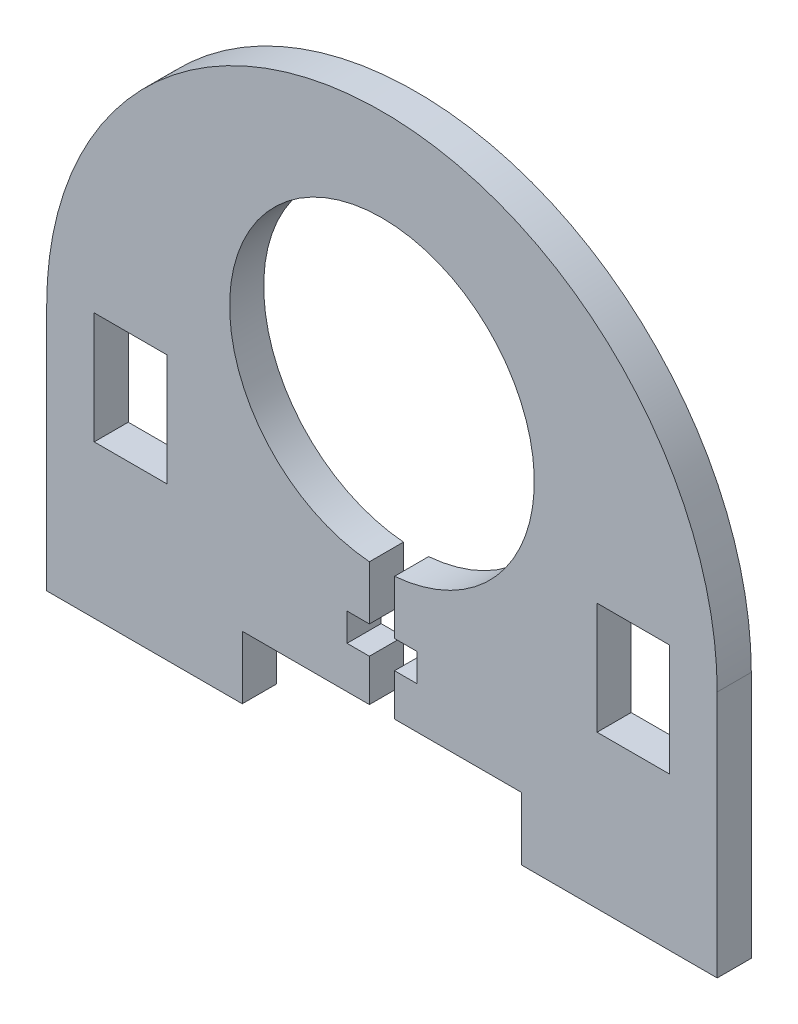
ISO-10303-21;
HEADER;
FILE_DESCRIPTION(('STEP AP214'),'2;1');
FILE_NAME('part.step','',(''),(''),'','','');
FILE_SCHEMA(('AUTOMOTIVE_DESIGN { 1 0 10303 214 1 1 1 1 }'));
ENDSEC;
DATA;
#1=APPLICATION_CONTEXT('core data for automotive mechanical design processes');
#2=APPLICATION_PROTOCOL_DEFINITION('international standard','automotive_design',2000,#1);
#3=PRODUCT_CONTEXT('',#1,'mechanical');
#4=PRODUCT('Part','Part','',(#3));
#5=PRODUCT_RELATED_PRODUCT_CATEGORY('part','',(#4));
#6=PRODUCT_DEFINITION_FORMATION('','',#4);
#7=PRODUCT_DEFINITION_CONTEXT('part definition',#1,'design');
#8=PRODUCT_DEFINITION('design','',#6,#7);
#9=PRODUCT_DEFINITION_SHAPE('','',#8);
#10=(LENGTH_UNIT() NAMED_UNIT(*) SI_UNIT(.MILLI.,.METRE.));
#11=(NAMED_UNIT(*) PLANE_ANGLE_UNIT() SI_UNIT($,.RADIAN.));
#12=(NAMED_UNIT(*) SI_UNIT($,.STERADIAN.) SOLID_ANGLE_UNIT());
#13=UNCERTAINTY_MEASURE_WITH_UNIT(LENGTH_MEASURE(1.E-05),#10,'distance_accuracy_value','');
#14=(GEOMETRIC_REPRESENTATION_CONTEXT(3) GLOBAL_UNCERTAINTY_ASSIGNED_CONTEXT((#13)) GLOBAL_UNIT_ASSIGNED_CONTEXT((#10,
#11,#12)) REPRESENTATION_CONTEXT('',''));
#15=CARTESIAN_POINT('',(0.,0.,0.));
#16=DIRECTION('',(0.,0.,1.));
#17=DIRECTION('',(1.,0.,0.));
#18=AXIS2_PLACEMENT_3D('',#15,#16,#17);
#19=CARTESIAN_POINT('',(-12.7,-5.54507996900001,-0.00100000000000013));
#20=DIRECTION('',(0.,1.,0.));
#21=DIRECTION('',(0.,0.,1.));
#22=AXIS2_PLACEMENT_3D('',#19,#20,#21);
#23=PLANE('',#22);
#24=DIRECTION('',(-1.,0.,0.));
#25=VECTOR('',#24,1.);
#26=CARTESIAN_POINT('',(-12.7,-5.54507996900001,3.0988));
#27=LINE('',#26,#25);
#28=CARTESIAN_POINT('',(12.7,-5.54507996900001,3.0988));
#29=VERTEX_POINT('',#28);
#30=CARTESIAN_POINT('',(1.143,-5.54507996900001,3.0988));
#31=VERTEX_POINT('',#30);
#32=EDGE_CURVE('E452',#29,#31,#27,.T.);
#33=ORIENTED_EDGE('',*,*,#32,.T.);
#34=DIRECTION('',(0.,0.,1.));
#35=VECTOR('',#34,1.);
#36=CARTESIAN_POINT('',(1.143,-5.54507996900001,-0.00100000000000013));
#37=LINE('',#36,#35);
#38=CARTESIAN_POINT('',(1.143,-5.54507996900001,0.));
#39=VERTEX_POINT('',#38);
#40=EDGE_CURVE('E413',#39,#31,#37,.T.);
#41=ORIENTED_EDGE('',*,*,#40,.F.);
#42=DIRECTION('',(-1.,0.,0.));
#43=VECTOR('',#42,1.);
#44=CARTESIAN_POINT('',(-12.7,-5.54507996900001,0.));
#45=LINE('',#44,#43);
#46=CARTESIAN_POINT('',(12.7,-5.54507996900001,0.));
#47=VERTEX_POINT('',#46);
#48=EDGE_CURVE('E436',#47,#39,#45,.T.);
#49=ORIENTED_EDGE('',*,*,#48,.F.);
#50=DIRECTION('',(0.,0.,1.));
#51=VECTOR('',#50,1.);
#52=CARTESIAN_POINT('',(12.7,-5.54507996900001,-0.00100000000000013));
#53=LINE('',#52,#51);
#54=EDGE_CURVE('E462',#47,#29,#53,.T.);
#55=ORIENTED_EDGE('',*,*,#54,.T.);
#56=EDGE_LOOP('',(#33,#41,#49,#55));
#57=FACE_BOUND('',#56,.T.);
#58=ADVANCED_FACE('F38',(#57),#23,.F.);
#59=CARTESIAN_POINT('',(30.48,-11.260079969,3.0988));
#60=DIRECTION('',(0.,1.,0.));
#61=DIRECTION('',(-1.,0.,0.));
#62=AXIS2_PLACEMENT_3D('',#59,#60,#61);
#63=PLANE('',#62);
#64=DIRECTION('',(1.,0.,0.));
#65=VECTOR('',#64,1.);
#66=CARTESIAN_POINT('',(30.48,-11.260079969,0.));
#67=LINE('',#66,#65);
#68=CARTESIAN_POINT('',(-30.48,-11.260079969,0.));
#69=VERTEX_POINT('',#68);
#70=CARTESIAN_POINT('',(-12.7,-11.260079969,0.));
#71=VERTEX_POINT('',#70);
#72=EDGE_CURVE('E503',#69,#71,#67,.T.);
#73=ORIENTED_EDGE('',*,*,#72,.T.);
#74=DIRECTION('',(0.,0.,1.));
#75=VECTOR('',#74,1.);
#76=CARTESIAN_POINT('',(-12.7,-11.260079969,-0.00100000000000013));
#77=LINE('',#76,#75);
#78=CARTESIAN_POINT('',(-12.7,-11.260079969,3.0988));
#79=VERTEX_POINT('',#78);
#80=EDGE_CURVE('E456',#71,#79,#77,.T.);
#81=ORIENTED_EDGE('',*,*,#80,.T.);
#82=DIRECTION('',(1.,0.,0.));
#83=VECTOR('',#82,1.);
#84=CARTESIAN_POINT('',(30.48,-11.260079969,3.0988));
#85=LINE('',#84,#83);
#86=CARTESIAN_POINT('',(-30.48,-11.260079969,3.0988));
#87=VERTEX_POINT('',#86);
#88=EDGE_CURVE('E488',#87,#79,#85,.T.);
#89=ORIENTED_EDGE('',*,*,#88,.F.);
#90=DIRECTION('',(0.,0.,-1.));
#91=VECTOR('',#90,1.);
#92=CARTESIAN_POINT('',(-30.48,-11.260079969,3.0988));
#93=LINE('',#92,#91);
#94=EDGE_CURVE('E47',#87,#69,#93,.T.);
#95=ORIENTED_EDGE('',*,*,#94,.T.);
#96=EDGE_LOOP('',(#73,#81,#89,#95));
#97=FACE_BOUND('',#96,.T.);
#98=ADVANCED_FACE('F521',(#97),#63,.F.);
#99=CARTESIAN_POINT('',(0.,11.260079969,3.0988));
#100=DIRECTION('',(0.,0.,-1.));
#101=DIRECTION('',(-1.,0.,0.));
#102=AXIS2_PLACEMENT_3D('',#99,#100,#101);
#103=CYLINDRICAL_SURFACE('',#102,30.48);
#104=CARTESIAN_POINT('',(0.,11.260079969,0.));
#105=DIRECTION('',(0.,0.,1.));
#106=DIRECTION('',(-1.,0.,0.));
#107=AXIS2_PLACEMENT_3D('',#104,#105,#106);
#108=CIRCLE('',#107,30.48);
#109=CARTESIAN_POINT('',(30.48,11.260079969,0.));
#110=VERTEX_POINT('',#109);
#111=CARTESIAN_POINT('',(-30.48,11.260079969,0.));
#112=VERTEX_POINT('',#111);
#113=EDGE_CURVE('E475',#110,#112,#108,.T.);
#114=ORIENTED_EDGE('',*,*,#113,.T.);
#115=DIRECTION('',(0.,0.,-1.));
#116=VECTOR('',#115,1.);
#117=CARTESIAN_POINT('',(-30.48,11.260079969,3.0988));
#118=LINE('',#117,#116);
#119=CARTESIAN_POINT('',(-30.48,11.260079969,3.0988));
#120=VERTEX_POINT('',#119);
#121=EDGE_CURVE('E11',#120,#112,#118,.T.);
#122=ORIENTED_EDGE('',*,*,#121,.F.);
#123=CARTESIAN_POINT('',(0.,11.260079969,3.0988));
#124=DIRECTION('',(0.,0.,1.));
#125=DIRECTION('',(-1.,0.,0.));
#126=AXIS2_PLACEMENT_3D('',#123,#124,#125);
#127=CIRCLE('',#126,30.48);
#128=CARTESIAN_POINT('',(30.48,11.260079969,3.0988));
#129=VERTEX_POINT('',#128);
#130=EDGE_CURVE('E479',#129,#120,#127,.T.);
#131=ORIENTED_EDGE('',*,*,#130,.F.);
#132=DIRECTION('',(0.,0.,-1.));
#133=VECTOR('',#132,1.);
#134=CARTESIAN_POINT('',(30.48,11.260079969,3.0988));
#135=LINE('',#134,#133);
#136=EDGE_CURVE('E495',#129,#110,#135,.T.);
#137=ORIENTED_EDGE('',*,*,#136,.T.);
#138=EDGE_LOOP('',(#114,#122,#131,#137));
#139=FACE_BOUND('',#138,.T.);
#140=ADVANCED_FACE('F40',(#139),#103,.T.);
#141=CARTESIAN_POINT('',(-30.48,-11.260079969,3.0988));
#142=DIRECTION('',(1.,0.,0.));
#143=DIRECTION('',(0.,1.,0.));
#144=AXIS2_PLACEMENT_3D('',#141,#142,#143);
#145=PLANE('',#144);
#146=DIRECTION('',(0.,-1.,0.));
#147=VECTOR('',#146,1.);
#148=CARTESIAN_POINT('',(-30.48,-11.260079969,0.));
#149=LINE('',#148,#147);
#150=EDGE_CURVE('E499',#112,#69,#149,.T.);
#151=ORIENTED_EDGE('',*,*,#150,.T.);
#152=ORIENTED_EDGE('',*,*,#94,.F.);
#153=DIRECTION('',(0.,-1.,0.));
#154=VECTOR('',#153,1.);
#155=CARTESIAN_POINT('',(-30.48,-11.260079969,3.0988));
#156=LINE('',#155,#154);
#157=EDGE_CURVE('E483',#120,#87,#156,.T.);
#158=ORIENTED_EDGE('',*,*,#157,.F.);
#159=ORIENTED_EDGE('',*,*,#121,.T.);
#160=EDGE_LOOP('',(#151,#152,#158,#159));
#161=FACE_BOUND('',#160,.T.);
#162=ADVANCED_FACE('F558',(#161),#145,.F.);
#163=CARTESIAN_POINT('',(12.7,-11.260079969,3.0988));
#164=VERTEX_POINT('',#163);
#165=CARTESIAN_POINT('',(30.48,-11.260079969,3.0988));
#166=VERTEX_POINT('',#165);
#167=EDGE_CURVE('E487',#164,#166,#85,.T.);
#168=ORIENTED_EDGE('',*,*,#167,.F.);
#169=DIRECTION('',(0.,0.,1.));
#170=VECTOR('',#169,1.);
#171=CARTESIAN_POINT('',(12.7,-11.260079969,-0.00100000000000013));
#172=LINE('',#171,#170);
#173=CARTESIAN_POINT('',(12.7,-11.260079969,0.));
#174=VERTEX_POINT('',#173);
#175=EDGE_CURVE('E465',#174,#164,#172,.T.);
#176=ORIENTED_EDGE('',*,*,#175,.F.);
#177=CARTESIAN_POINT('',(30.48,-11.260079969,0.));
#178=VERTEX_POINT('',#177);
#179=EDGE_CURVE('E502',#174,#178,#67,.T.);
#180=ORIENTED_EDGE('',*,*,#179,.T.);
#181=DIRECTION('',(0.,0.,-1.));
#182=VECTOR('',#181,1.);
#183=CARTESIAN_POINT('',(30.48,-11.260079969,3.0988));
#184=LINE('',#183,#182);
#185=EDGE_CURVE('E512',#166,#178,#184,.T.);
#186=ORIENTED_EDGE('',*,*,#185,.F.);
#187=EDGE_LOOP('',(#168,#176,#180,#186));
#188=FACE_BOUND('',#187,.T.);
#189=ADVANCED_FACE('F550',(#188),#63,.F.);
#190=CARTESIAN_POINT('',(30.48,-11.260079969,3.0988));
#191=DIRECTION('',(-1.,0.,0.));
#192=DIRECTION('',(0.,-1.,0.));
#193=AXIS2_PLACEMENT_3D('',#190,#191,#192);
#194=PLANE('',#193);
#195=DIRECTION('',(0.,1.,0.));
#196=VECTOR('',#195,1.);
#197=CARTESIAN_POINT('',(30.48,-11.260079969,0.));
#198=LINE('',#197,#196);
#199=EDGE_CURVE('E484',#178,#110,#198,.T.);
#200=ORIENTED_EDGE('',*,*,#199,.T.);
#201=ORIENTED_EDGE('',*,*,#136,.F.);
#202=DIRECTION('',(0.,1.,0.));
#203=VECTOR('',#202,1.);
#204=CARTESIAN_POINT('',(30.48,-11.260079969,3.0988));
#205=LINE('',#204,#203);
#206=EDGE_CURVE('E492',#166,#129,#205,.T.);
#207=ORIENTED_EDGE('',*,*,#206,.F.);
#208=ORIENTED_EDGE('',*,*,#185,.T.);
#209=EDGE_LOOP('',(#200,#201,#207,#208));
#210=FACE_BOUND('',#209,.T.);
#211=ADVANCED_FACE('F554',(#210),#194,.F.);
#212=CARTESIAN_POINT('',(0.,11.260079969,3.0988));
#213=DIRECTION('',(0.,0.,-1.));
#214=DIRECTION('',(-1.,0.,0.));
#215=AXIS2_PLACEMENT_3D('',#212,#213,#214);
#216=PLANE('',#215);
#217=DIRECTION('',(1.,0.,0.));
#218=VECTOR('',#217,1.);
#219=CARTESIAN_POINT('',(-26.162,2.63046484748747,3.0988));
#220=LINE('',#219,#218);
#221=CARTESIAN_POINT('',(-26.162,2.63046484748747,3.0988));
#222=VERTEX_POINT('',#221);
#223=CARTESIAN_POINT('',(-19.558,2.63046484748747,3.0988));
#224=VERTEX_POINT('',#223);
#225=EDGE_CURVE('E253',#222,#224,#220,.T.);
#226=ORIENTED_EDGE('',*,*,#225,.F.);
#227=DIRECTION('',(0.,-1.,0.));
#228=VECTOR('',#227,1.);
#229=CARTESIAN_POINT('',(-26.162,12.7904648474875,3.0988));
#230=LINE('',#229,#228);
#231=CARTESIAN_POINT('',(-26.162,12.7904648474875,3.0988));
#232=VERTEX_POINT('',#231);
#233=EDGE_CURVE('E54',#232,#222,#230,.T.);
#234=ORIENTED_EDGE('',*,*,#233,.F.);
#235=DIRECTION('',(-1.,0.,0.));
#236=VECTOR('',#235,1.);
#237=CARTESIAN_POINT('',(-26.162,12.7904648474875,3.0988));
#238=LINE('',#237,#236);
#239=CARTESIAN_POINT('',(-19.558,12.7904648474875,3.0988));
#240=VERTEX_POINT('',#239);
#241=EDGE_CURVE('E243',#240,#232,#238,.T.);
#242=ORIENTED_EDGE('',*,*,#241,.F.);
#243=DIRECTION('',(0.,1.,0.));
#244=VECTOR('',#243,1.);
#245=CARTESIAN_POINT('',(-19.558,12.7904648474875,3.0988));
#246=LINE('',#245,#244);
#247=EDGE_CURVE('E261',#224,#240,#246,.T.);
#248=ORIENTED_EDGE('',*,*,#247,.F.);
#249=EDGE_LOOP('',(#226,#234,#242,#248));
#250=FACE_BOUND('',#249,.T.);
#251=DIRECTION('',(0.,-1.,0.));
#252=VECTOR('',#251,1.);
#253=CARTESIAN_POINT('',(19.558,12.7904648474875,3.0988));
#254=LINE('',#253,#252);
#255=CARTESIAN_POINT('',(19.558,12.7904648474875,3.0988));
#256=VERTEX_POINT('',#255);
#257=CARTESIAN_POINT('',(19.558,2.63046484748747,3.0988));
#258=VERTEX_POINT('',#257);
#259=EDGE_CURVE('E289',#256,#258,#254,.T.);
#260=ORIENTED_EDGE('',*,*,#259,.F.);
#261=DIRECTION('',(-1.,0.,0.));
#262=VECTOR('',#261,1.);
#263=CARTESIAN_POINT('',(26.162,12.7904648474875,3.0988));
#264=LINE('',#263,#262);
#265=CARTESIAN_POINT('',(26.162,12.7904648474875,3.0988));
#266=VERTEX_POINT('',#265);
#267=EDGE_CURVE('E62',#266,#256,#264,.T.);
#268=ORIENTED_EDGE('',*,*,#267,.F.);
#269=DIRECTION('',(0.,1.,0.));
#270=VECTOR('',#269,1.);
#271=CARTESIAN_POINT('',(26.162,12.7904648474875,3.0988));
#272=LINE('',#271,#270);
#273=CARTESIAN_POINT('',(26.162,2.63046484748747,3.0988));
#274=VERTEX_POINT('',#273);
#275=EDGE_CURVE('E297',#274,#266,#272,.T.);
#276=ORIENTED_EDGE('',*,*,#275,.F.);
#277=DIRECTION('',(1.,0.,0.));
#278=VECTOR('',#277,1.);
#279=CARTESIAN_POINT('',(26.162,2.63046484748747,3.0988));
#280=LINE('',#279,#278);
#281=EDGE_CURVE('E293',#258,#274,#280,.T.);
#282=ORIENTED_EDGE('',*,*,#281,.F.);
#283=EDGE_LOOP('',(#260,#268,#276,#282));
#284=FACE_BOUND('',#283,.T.);
#285=CARTESIAN_POINT('',(0.,19.504919969,3.0988));
#286=DIRECTION('',(0.,0.,1.));
#287=DIRECTION('',(1.,0.,0.));
#288=AXIS2_PLACEMENT_3D('',#285,#286,#287);
#289=CIRCLE('',#288,13.85);
#290=CARTESIAN_POINT('',(1.143,5.70216477302552,3.0988));
#291=VERTEX_POINT('',#290);
#292=CARTESIAN_POINT('',(-1.143,5.70216477302552,3.0988));
#293=VERTEX_POINT('',#292);
#294=EDGE_CURVE('E471',#291,#293,#289,.T.);
#295=ORIENTED_EDGE('',*,*,#294,.F.);
#296=DIRECTION('',(0.,1.,0.));
#297=VECTOR('',#296,1.);
#298=CARTESIAN_POINT('',(1.143,0.804920030999987,3.0988));
#299=LINE('',#298,#297);
#300=CARTESIAN_POINT('',(1.143,0.804920030999987,3.0988));
#301=VERTEX_POINT('',#300);
#302=EDGE_CURVE('E389',#301,#291,#299,.T.);
#303=ORIENTED_EDGE('',*,*,#302,.F.);
#304=DIRECTION('',(-1.,0.,0.));
#305=VECTOR('',#304,1.);
#306=CARTESIAN_POINT('',(3.175,0.804920030999988,3.0988));
#307=LINE('',#306,#305);
#308=CARTESIAN_POINT('',(3.175,0.804920030999988,3.0988));
#309=VERTEX_POINT('',#308);
#310=EDGE_CURVE('E385',#309,#301,#307,.T.);
#311=ORIENTED_EDGE('',*,*,#310,.F.);
#312=DIRECTION('',(0.,1.,0.));
#313=VECTOR('',#312,1.);
#314=CARTESIAN_POINT('',(3.175,-1.73507996900001,3.0988));
#315=LINE('',#314,#313);
#316=CARTESIAN_POINT('',(3.175,-1.73507996900001,3.0988));
#317=VERTEX_POINT('',#316);
#318=EDGE_CURVE('E381',#317,#309,#315,.T.);
#319=ORIENTED_EDGE('',*,*,#318,.F.);
#320=DIRECTION('',(1.,0.,0.));
#321=VECTOR('',#320,1.);
#322=CARTESIAN_POINT('',(3.175,-1.73507996900001,3.0988));
#323=LINE('',#322,#321);
#324=CARTESIAN_POINT('',(1.143,-1.73507996900001,3.0988));
#325=VERTEX_POINT('',#324);
#326=EDGE_CURVE('E377',#325,#317,#323,.T.);
#327=ORIENTED_EDGE('',*,*,#326,.F.);
#328=DIRECTION('',(0.,1.,0.));
#329=VECTOR('',#328,1.);
#330=CARTESIAN_POINT('',(1.143,-5.54507996900001,3.0988));
#331=LINE('',#330,#329);
#332=EDGE_CURVE('E373',#31,#325,#331,.T.);
#333=ORIENTED_EDGE('',*,*,#332,.F.);
#334=ORIENTED_EDGE('',*,*,#32,.F.);
#335=DIRECTION('',(0.,1.,0.));
#336=VECTOR('',#335,1.);
#337=CARTESIAN_POINT('',(12.7,-11.260079969,3.0988));
#338=LINE('',#337,#336);
#339=EDGE_CURVE('E447',#164,#29,#338,.T.);
#340=ORIENTED_EDGE('',*,*,#339,.F.);
#341=ORIENTED_EDGE('',*,*,#167,.T.);
#342=ORIENTED_EDGE('',*,*,#206,.T.);
#343=ORIENTED_EDGE('',*,*,#130,.T.);
#344=ORIENTED_EDGE('',*,*,#157,.T.);
#345=ORIENTED_EDGE('',*,*,#88,.T.);
#346=DIRECTION('',(0.,-1.,0.));
#347=VECTOR('',#346,1.);
#348=CARTESIAN_POINT('',(-12.7,-11.260079969,3.0988));
#349=LINE('',#348,#347);
#350=CARTESIAN_POINT('',(-12.7,-5.54507996900001,3.0988));
#351=VERTEX_POINT('',#350);
#352=EDGE_CURVE('E444',#351,#79,#349,.T.);
#353=ORIENTED_EDGE('',*,*,#352,.F.);
#354=CARTESIAN_POINT('',(-1.143,-5.54507996900001,3.0988));
#355=VERTEX_POINT('',#354);
#356=EDGE_CURVE('E451',#355,#351,#27,.T.);
#357=ORIENTED_EDGE('',*,*,#356,.F.);
#358=DIRECTION('',(0.,-1.,0.));
#359=VECTOR('',#358,1.);
#360=CARTESIAN_POINT('',(-1.143,-5.54507996900001,3.0988));
#361=LINE('',#360,#359);
#362=CARTESIAN_POINT('',(-1.143,-1.73507996900001,3.0988));
#363=VERTEX_POINT('',#362);
#364=EDGE_CURVE('E370',#363,#355,#361,.T.);
#365=ORIENTED_EDGE('',*,*,#364,.F.);
#366=DIRECTION('',(1.,0.,0.));
#367=VECTOR('',#366,1.);
#368=CARTESIAN_POINT('',(-1.143,-1.73507996900001,3.0988));
#369=LINE('',#368,#367);
#370=CARTESIAN_POINT('',(-3.175,-1.73507996900001,3.0988));
#371=VERTEX_POINT('',#370);
#372=EDGE_CURVE('E366',#371,#363,#369,.T.);
#373=ORIENTED_EDGE('',*,*,#372,.F.);
#374=DIRECTION('',(0.,-1.,0.));
#375=VECTOR('',#374,1.);
#376=CARTESIAN_POINT('',(-3.175,-1.73507996900001,3.0988));
#377=LINE('',#376,#375);
#378=CARTESIAN_POINT('',(-3.175,0.804920030999987,3.0988));
#379=VERTEX_POINT('',#378);
#380=EDGE_CURVE('E362',#379,#371,#377,.T.);
#381=ORIENTED_EDGE('',*,*,#380,.F.);
#382=DIRECTION('',(-1.,0.,0.));
#383=VECTOR('',#382,1.);
#384=CARTESIAN_POINT('',(-1.143,0.804920030999988,3.0988));
#385=LINE('',#384,#383);
#386=CARTESIAN_POINT('',(-1.143,0.804920030999988,3.0988));
#387=VERTEX_POINT('',#386);
#388=EDGE_CURVE('E358',#387,#379,#385,.T.);
#389=ORIENTED_EDGE('',*,*,#388,.F.);
#390=DIRECTION('',(0.,-1.,0.));
#391=VECTOR('',#390,1.);
#392=CARTESIAN_POINT('',(-1.143,0.804920030999988,3.0988));
#393=LINE('',#392,#391);
#394=EDGE_CURVE('E392',#293,#387,#393,.T.);
#395=ORIENTED_EDGE('',*,*,#394,.F.);
#396=EDGE_LOOP('',(#295,#303,#311,#319,#327,#333,#334,#340,#341,#342,#343,#344,#345,#353,#357,
#365,#373,#381,#389,#395));
#397=FACE_BOUND('',#396,.T.);
#398=ADVANCED_FACE('F544',(#250,#284,#397),#216,.F.);
#399=CARTESIAN_POINT('',(0.,11.260079969,0.));
#400=DIRECTION('',(0.,0.,-1.));
#401=DIRECTION('',(-1.,0.,0.));
#402=AXIS2_PLACEMENT_3D('',#399,#400,#401);
#403=PLANE('',#402);
#404=DIRECTION('',(0.,-1.,0.));
#405=VECTOR('',#404,1.);
#406=CARTESIAN_POINT('',(-26.162,12.7904648474875,0.));
#407=LINE('',#406,#405);
#408=CARTESIAN_POINT('',(-26.162,12.7904648474875,0.));
#409=VERTEX_POINT('',#408);
#410=CARTESIAN_POINT('',(-26.162,2.63046484748747,0.));
#411=VERTEX_POINT('',#410);
#412=EDGE_CURVE('E240',#409,#411,#407,.T.);
#413=ORIENTED_EDGE('',*,*,#412,.T.);
#414=DIRECTION('',(1.,0.,0.));
#415=VECTOR('',#414,1.);
#416=CARTESIAN_POINT('',(-26.162,2.63046484748747,0.));
#417=LINE('',#416,#415);
#418=CARTESIAN_POINT('',(-19.558,2.63046484748747,0.));
#419=VERTEX_POINT('',#418);
#420=EDGE_CURVE('E225',#411,#419,#417,.T.);
#421=ORIENTED_EDGE('',*,*,#420,.T.);
#422=DIRECTION('',(0.,1.,0.));
#423=VECTOR('',#422,1.);
#424=CARTESIAN_POINT('',(-19.558,12.7904648474875,0.));
#425=LINE('',#424,#423);
#426=CARTESIAN_POINT('',(-19.558,12.7904648474875,0.));
#427=VERTEX_POINT('',#426);
#428=EDGE_CURVE('E255',#419,#427,#425,.T.);
#429=ORIENTED_EDGE('',*,*,#428,.T.);
#430=DIRECTION('',(-1.,0.,0.));
#431=VECTOR('',#430,1.);
#432=CARTESIAN_POINT('',(-26.162,12.7904648474875,0.));
#433=LINE('',#432,#431);
#434=EDGE_CURVE('E248',#427,#409,#433,.T.);
#435=ORIENTED_EDGE('',*,*,#434,.T.);
#436=EDGE_LOOP('',(#413,#421,#429,#435));
#437=FACE_BOUND('',#436,.T.);
#438=DIRECTION('',(-1.,0.,0.));
#439=VECTOR('',#438,1.);
#440=CARTESIAN_POINT('',(26.162,12.7904648474875,0.));
#441=LINE('',#440,#439);
#442=CARTESIAN_POINT('',(26.162,12.7904648474875,0.));
#443=VERTEX_POINT('',#442);
#444=CARTESIAN_POINT('',(19.558,12.7904648474875,0.));
#445=VERTEX_POINT('',#444);
#446=EDGE_CURVE('E283',#443,#445,#441,.T.);
#447=ORIENTED_EDGE('',*,*,#446,.T.);
#448=DIRECTION('',(0.,-1.,0.));
#449=VECTOR('',#448,1.);
#450=CARTESIAN_POINT('',(19.558,12.7904648474875,0.));
#451=LINE('',#450,#449);
#452=CARTESIAN_POINT('',(19.558,2.63046484748747,0.));
#453=VERTEX_POINT('',#452);
#454=EDGE_CURVE('E305',#445,#453,#451,.T.);
#455=ORIENTED_EDGE('',*,*,#454,.T.);
#456=DIRECTION('',(1.,0.,0.));
#457=VECTOR('',#456,1.);
#458=CARTESIAN_POINT('',(26.162,2.63046484748747,0.));
#459=LINE('',#458,#457);
#460=CARTESIAN_POINT('',(26.162,2.63046484748747,0.));
#461=VERTEX_POINT('',#460);
#462=EDGE_CURVE('E275',#453,#461,#459,.T.);
#463=ORIENTED_EDGE('',*,*,#462,.T.);
#464=DIRECTION('',(0.,1.,0.));
#465=VECTOR('',#464,1.);
#466=CARTESIAN_POINT('',(26.162,12.7904648474875,0.));
#467=LINE('',#466,#465);
#468=EDGE_CURVE('E279',#461,#443,#467,.T.);
#469=ORIENTED_EDGE('',*,*,#468,.T.);
#470=EDGE_LOOP('',(#447,#455,#463,#469));
#471=FACE_BOUND('',#470,.T.);
#472=DIRECTION('',(0.,1.,0.));
#473=VECTOR('',#472,1.);
#474=CARTESIAN_POINT('',(1.143,0.804920030999987,0.));
#475=LINE('',#474,#473);
#476=CARTESIAN_POINT('',(1.143,0.804920030999987,0.));
#477=VERTEX_POINT('',#476);
#478=CARTESIAN_POINT('',(1.143,5.70216477302552,0.));
#479=VERTEX_POINT('',#478);
#480=EDGE_CURVE('E354',#477,#479,#475,.T.);
#481=ORIENTED_EDGE('',*,*,#480,.T.);
#482=CARTESIAN_POINT('',(0.,19.504919969,0.));
#483=DIRECTION('',(0.,0.,-1.));
#484=DIRECTION('',(-1.,0.,0.));
#485=AXIS2_PLACEMENT_3D('',#482,#483,#484);
#486=CIRCLE('',#485,13.85);
#487=CARTESIAN_POINT('',(-1.143,5.70216477302552,0.));
#488=VERTEX_POINT('',#487);
#489=EDGE_CURVE('E461',#479,#488,#486,.F.);
#490=ORIENTED_EDGE('',*,*,#489,.T.);
#491=DIRECTION('',(0.,-1.,0.));
#492=VECTOR('',#491,1.);
#493=CARTESIAN_POINT('',(-1.143,0.804920030999988,0.));
#494=LINE('',#493,#492);
#495=CARTESIAN_POINT('',(-1.143,0.804920030999988,0.));
#496=VERTEX_POINT('',#495);
#497=EDGE_CURVE('E334',#488,#496,#494,.T.);
#498=ORIENTED_EDGE('',*,*,#497,.T.);
#499=DIRECTION('',(-1.,0.,0.));
#500=VECTOR('',#499,1.);
#501=CARTESIAN_POINT('',(-1.143,0.804920030999988,0.));
#502=LINE('',#501,#500);
#503=CARTESIAN_POINT('',(-3.175,0.804920030999987,0.));
#504=VERTEX_POINT('',#503);
#505=EDGE_CURVE('E330',#496,#504,#502,.T.);
#506=ORIENTED_EDGE('',*,*,#505,.T.);
#507=DIRECTION('',(0.,-1.,0.));
#508=VECTOR('',#507,1.);
#509=CARTESIAN_POINT('',(-3.175,-1.73507996900001,0.));
#510=LINE('',#509,#508);
#511=CARTESIAN_POINT('',(-3.175,-1.73507996900001,0.));
#512=VERTEX_POINT('',#511);
#513=EDGE_CURVE('E400',#504,#512,#510,.T.);
#514=ORIENTED_EDGE('',*,*,#513,.T.);
#515=DIRECTION('',(1.,0.,0.));
#516=VECTOR('',#515,1.);
#517=CARTESIAN_POINT('',(-1.143,-1.73507996900001,0.));
#518=LINE('',#517,#516);
#519=CARTESIAN_POINT('',(-1.143,-1.73507996900001,0.));
#520=VERTEX_POINT('',#519);
#521=EDGE_CURVE('E322',#512,#520,#518,.T.);
#522=ORIENTED_EDGE('',*,*,#521,.T.);
#523=DIRECTION('',(0.,-1.,0.));
#524=VECTOR('',#523,1.);
#525=CARTESIAN_POINT('',(-1.143,-5.54507996900001,0.));
#526=LINE('',#525,#524);
#527=CARTESIAN_POINT('',(-1.143,-5.54507996900001,0.));
#528=VERTEX_POINT('',#527);
#529=EDGE_CURVE('E326',#520,#528,#526,.T.);
#530=ORIENTED_EDGE('',*,*,#529,.T.);
#531=CARTESIAN_POINT('',(-12.7,-5.54507996900001,0.));
#532=VERTEX_POINT('',#531);
#533=EDGE_CURVE('E435',#528,#532,#45,.T.);
#534=ORIENTED_EDGE('',*,*,#533,.T.);
#535=DIRECTION('',(0.,-1.,0.));
#536=VECTOR('',#535,1.);
#537=CARTESIAN_POINT('',(-12.7,-11.260079969,0.));
#538=LINE('',#537,#536);
#539=EDGE_CURVE('E440',#532,#71,#538,.T.);
#540=ORIENTED_EDGE('',*,*,#539,.T.);
#541=ORIENTED_EDGE('',*,*,#72,.F.);
#542=ORIENTED_EDGE('',*,*,#150,.F.);
#543=ORIENTED_EDGE('',*,*,#113,.F.);
#544=ORIENTED_EDGE('',*,*,#199,.F.);
#545=ORIENTED_EDGE('',*,*,#179,.F.);
#546=DIRECTION('',(0.,1.,0.));
#547=VECTOR('',#546,1.);
#548=CARTESIAN_POINT('',(12.7,-11.260079969,0.));
#549=LINE('',#548,#547);
#550=EDGE_CURVE('E431',#174,#47,#549,.T.);
#551=ORIENTED_EDGE('',*,*,#550,.T.);
#552=ORIENTED_EDGE('',*,*,#48,.T.);
#553=DIRECTION('',(0.,1.,0.));
#554=VECTOR('',#553,1.);
#555=CARTESIAN_POINT('',(1.143,-5.54507996900001,0.));
#556=LINE('',#555,#554);
#557=CARTESIAN_POINT('',(1.143,-1.73507996900001,0.));
#558=VERTEX_POINT('',#557);
#559=EDGE_CURVE('E338',#39,#558,#556,.T.);
#560=ORIENTED_EDGE('',*,*,#559,.T.);
#561=DIRECTION('',(1.,0.,0.));
#562=VECTOR('',#561,1.);
#563=CARTESIAN_POINT('',(3.175,-1.73507996900001,0.));
#564=LINE('',#563,#562);
#565=CARTESIAN_POINT('',(3.175,-1.73507996900001,0.));
#566=VERTEX_POINT('',#565);
#567=EDGE_CURVE('E342',#558,#566,#564,.T.);
#568=ORIENTED_EDGE('',*,*,#567,.T.);
#569=DIRECTION('',(0.,1.,0.));
#570=VECTOR('',#569,1.);
#571=CARTESIAN_POINT('',(3.175,-1.73507996900001,0.));
#572=LINE('',#571,#570);
#573=CARTESIAN_POINT('',(3.175,0.804920030999988,0.));
#574=VERTEX_POINT('',#573);
#575=EDGE_CURVE('E346',#566,#574,#572,.T.);
#576=ORIENTED_EDGE('',*,*,#575,.T.);
#577=DIRECTION('',(-1.,0.,0.));
#578=VECTOR('',#577,1.);
#579=CARTESIAN_POINT('',(3.175,0.804920030999988,0.));
#580=LINE('',#579,#578);
#581=EDGE_CURVE('E350',#574,#477,#580,.T.);
#582=ORIENTED_EDGE('',*,*,#581,.T.);
#583=EDGE_LOOP('',(#481,#490,#498,#506,#514,#522,#530,#534,#540,#541,#542,#543,#544,#545,#551,
#552,#560,#568,#576,#582));
#584=FACE_BOUND('',#583,.T.);
#585=ADVANCED_FACE('F246',(#437,#471,#584),#403,.T.);
#586=CARTESIAN_POINT('',(0.,19.504919969,-0.00100000000000013));
#587=DIRECTION('',(0.,0.,1.));
#588=DIRECTION('',(1.,0.,0.));
#589=AXIS2_PLACEMENT_3D('',#586,#587,#588);
#590=CYLINDRICAL_SURFACE('',#589,13.85);
#591=ORIENTED_EDGE('',*,*,#294,.T.);
#592=DIRECTION('',(0.,0.,1.));
#593=VECTOR('',#592,1.);
#594=CARTESIAN_POINT('',(-1.143,5.70216477302552,-0.00100000000000013));
#595=LINE('',#594,#593);
#596=EDGE_CURVE('E319',#488,#293,#595,.T.);
#597=ORIENTED_EDGE('',*,*,#596,.F.);
#598=ORIENTED_EDGE('',*,*,#489,.F.);
#599=DIRECTION('',(0.,0.,1.));
#600=VECTOR('',#599,1.);
#601=CARTESIAN_POINT('',(1.143,5.70216477302552,-0.00100000000000013));
#602=LINE('',#601,#600);
#603=EDGE_CURVE('E236',#291,#479,#602,.F.);
#604=ORIENTED_EDGE('',*,*,#603,.F.);
#605=EDGE_LOOP('',(#591,#597,#598,#604));
#606=FACE_BOUND('',#605,.T.);
#607=ADVANCED_FACE('F587',(#606),#590,.F.);
#608=CARTESIAN_POINT('',(-12.7,-11.260079969,-0.00100000000000013));
#609=DIRECTION('',(-1.,0.,0.));
#610=DIRECTION('',(0.,0.,1.));
#611=AXIS2_PLACEMENT_3D('',#608,#609,#610);
#612=PLANE('',#611);
#613=DIRECTION('',(0.,0.,1.));
#614=VECTOR('',#613,1.);
#615=CARTESIAN_POINT('',(-12.7,-5.54507996900001,-0.00100000000000013));
#616=LINE('',#615,#614);
#617=EDGE_CURVE('E457',#532,#351,#616,.T.);
#618=ORIENTED_EDGE('',*,*,#617,.T.);
#619=ORIENTED_EDGE('',*,*,#352,.T.);
#620=ORIENTED_EDGE('',*,*,#80,.F.);
#621=ORIENTED_EDGE('',*,*,#539,.F.);
#622=EDGE_LOOP('',(#618,#619,#620,#621));
#623=FACE_BOUND('',#622,.T.);
#624=ADVANCED_FACE('F529',(#623),#612,.F.);
#625=ORIENTED_EDGE('',*,*,#533,.F.);
#626=DIRECTION('',(0.,0.,1.));
#627=VECTOR('',#626,1.);
#628=CARTESIAN_POINT('',(-1.143,-5.54507996900001,-0.00100000000000013));
#629=LINE('',#628,#627);
#630=EDGE_CURVE('E416',#528,#355,#629,.T.);
#631=ORIENTED_EDGE('',*,*,#630,.T.);
#632=ORIENTED_EDGE('',*,*,#356,.T.);
#633=ORIENTED_EDGE('',*,*,#617,.F.);
#634=EDGE_LOOP('',(#625,#631,#632,#633));
#635=FACE_BOUND('',#634,.T.);
#636=ADVANCED_FACE('F532',(#635),#23,.F.);
#637=CARTESIAN_POINT('',(12.7,-11.260079969,-0.00100000000000013));
#638=DIRECTION('',(1.,0.,0.));
#639=DIRECTION('',(0.,0.,-1.));
#640=AXIS2_PLACEMENT_3D('',#637,#638,#639);
#641=PLANE('',#640);
#642=ORIENTED_EDGE('',*,*,#175,.T.);
#643=ORIENTED_EDGE('',*,*,#339,.T.);
#644=ORIENTED_EDGE('',*,*,#54,.F.);
#645=ORIENTED_EDGE('',*,*,#550,.F.);
#646=EDGE_LOOP('',(#642,#643,#644,#645));
#647=FACE_BOUND('',#646,.T.);
#648=ADVANCED_FACE('F561',(#647),#641,.F.);
#649=CARTESIAN_POINT('',(-1.143,-5.54507996900001,-0.00100000000000013));
#650=DIRECTION('',(-1.,0.,0.));
#651=DIRECTION('',(0.,-1.,0.));
#652=AXIS2_PLACEMENT_3D('',#649,#650,#651);
#653=PLANE('',#652);
#654=DIRECTION('',(0.,0.,1.));
#655=VECTOR('',#654,1.);
#656=CARTESIAN_POINT('',(-1.143,-1.73507996900001,-0.00100000000000013));
#657=LINE('',#656,#655);
#658=EDGE_CURVE('E420',#520,#363,#657,.T.);
#659=ORIENTED_EDGE('',*,*,#658,.T.);
#660=ORIENTED_EDGE('',*,*,#364,.T.);
#661=ORIENTED_EDGE('',*,*,#630,.F.);
#662=ORIENTED_EDGE('',*,*,#529,.F.);
#663=EDGE_LOOP('',(#659,#660,#661,#662));
#664=FACE_BOUND('',#663,.T.);
#665=ADVANCED_FACE('F605',(#664),#653,.F.);
#666=CARTESIAN_POINT('',(-3.175,-1.73507996900001,-0.00100000000000013));
#667=DIRECTION('',(-1.,0.,0.));
#668=DIRECTION('',(0.,0.,1.));
#669=AXIS2_PLACEMENT_3D('',#666,#667,#668);
#670=PLANE('',#669);
#671=DIRECTION('',(0.,0.,1.));
#672=VECTOR('',#671,1.);
#673=CARTESIAN_POINT('',(-3.175,0.804920030999987,-0.00100000000000013));
#674=LINE('',#673,#672);
#675=EDGE_CURVE('E396',#504,#379,#674,.T.);
#676=ORIENTED_EDGE('',*,*,#675,.T.);
#677=ORIENTED_EDGE('',*,*,#380,.T.);
#678=DIRECTION('',(0.,0.,1.));
#679=VECTOR('',#678,1.);
#680=CARTESIAN_POINT('',(-3.175,-1.73507996900001,-0.00100000000000013));
#681=LINE('',#680,#679);
#682=EDGE_CURVE('E423',#512,#371,#681,.T.);
#683=ORIENTED_EDGE('',*,*,#682,.F.);
#684=ORIENTED_EDGE('',*,*,#513,.F.);
#685=EDGE_LOOP('',(#676,#677,#683,#684));
#686=FACE_BOUND('',#685,.T.);
#687=ADVANCED_FACE('F600',(#686),#670,.F.);
#688=CARTESIAN_POINT('',(-1.143,-1.73507996900001,-0.00100000000000013));
#689=DIRECTION('',(0.,-1.,0.));
#690=DIRECTION('',(0.,0.,-1.));
#691=AXIS2_PLACEMENT_3D('',#688,#689,#690);
#692=PLANE('',#691);
#693=ORIENTED_EDGE('',*,*,#682,.T.);
#694=ORIENTED_EDGE('',*,*,#372,.T.);
#695=ORIENTED_EDGE('',*,*,#658,.F.);
#696=ORIENTED_EDGE('',*,*,#521,.F.);
#697=EDGE_LOOP('',(#693,#694,#695,#696));
#698=FACE_BOUND('',#697,.T.);
#699=ADVANCED_FACE('F602',(#698),#692,.F.);
#700=CARTESIAN_POINT('',(-1.143,0.804920030999988,-0.00100000000000013));
#701=DIRECTION('',(-1.,0.,0.));
#702=DIRECTION('',(0.,-1.,0.));
#703=AXIS2_PLACEMENT_3D('',#700,#701,#702);
#704=PLANE('',#703);
#705=ORIENTED_EDGE('',*,*,#596,.T.);
#706=ORIENTED_EDGE('',*,*,#394,.T.);
#707=DIRECTION('',(0.,0.,1.));
#708=VECTOR('',#707,1.);
#709=CARTESIAN_POINT('',(-1.143,0.804920030999988,-0.00100000000000013));
#710=LINE('',#709,#708);
#711=EDGE_CURVE('E397',#496,#387,#710,.T.);
#712=ORIENTED_EDGE('',*,*,#711,.F.);
#713=ORIENTED_EDGE('',*,*,#497,.F.);
#714=EDGE_LOOP('',(#705,#706,#712,#713));
#715=FACE_BOUND('',#714,.T.);
#716=ADVANCED_FACE('F590',(#715),#704,.F.);
#717=CARTESIAN_POINT('',(-1.143,0.804920030999988,-0.00100000000000013));
#718=DIRECTION('',(0.,1.,0.));
#719=DIRECTION('',(-1.,0.,0.));
#720=AXIS2_PLACEMENT_3D('',#717,#718,#719);
#721=PLANE('',#720);
#722=ORIENTED_EDGE('',*,*,#711,.T.);
#723=ORIENTED_EDGE('',*,*,#388,.T.);
#724=ORIENTED_EDGE('',*,*,#675,.F.);
#725=ORIENTED_EDGE('',*,*,#505,.F.);
#726=EDGE_LOOP('',(#722,#723,#724,#725));
#727=FACE_BOUND('',#726,.T.);
#728=ADVANCED_FACE('F597',(#727),#721,.F.);
#729=CARTESIAN_POINT('',(1.143,0.804920030999987,-0.00100000000000013));
#730=DIRECTION('',(1.,0.,0.));
#731=DIRECTION('',(0.,1.,0.));
#732=AXIS2_PLACEMENT_3D('',#729,#730,#731);
#733=PLANE('',#732);
#734=DIRECTION('',(0.,0.,1.));
#735=VECTOR('',#734,1.);
#736=CARTESIAN_POINT('',(1.143,0.804920030999987,-0.00100000000000013));
#737=LINE('',#736,#735);
#738=EDGE_CURVE('E401',#477,#301,#737,.T.);
#739=ORIENTED_EDGE('',*,*,#738,.T.);
#740=ORIENTED_EDGE('',*,*,#302,.T.);
#741=ORIENTED_EDGE('',*,*,#603,.T.);
#742=ORIENTED_EDGE('',*,*,#480,.F.);
#743=EDGE_LOOP('',(#739,#740,#741,#742));
#744=FACE_BOUND('',#743,.T.);
#745=ADVANCED_FACE('F582',(#744),#733,.F.);
#746=CARTESIAN_POINT('',(3.175,0.804920030999988,-0.00100000000000013));
#747=DIRECTION('',(0.,1.,0.));
#748=DIRECTION('',(-1.,0.,0.));
#749=AXIS2_PLACEMENT_3D('',#746,#747,#748);
#750=PLANE('',#749);
#751=DIRECTION('',(0.,0.,1.));
#752=VECTOR('',#751,1.);
#753=CARTESIAN_POINT('',(3.175,0.804920030999988,-0.00100000000000013));
#754=LINE('',#753,#752);
#755=EDGE_CURVE('E404',#574,#309,#754,.T.);
#756=ORIENTED_EDGE('',*,*,#755,.T.);
#757=ORIENTED_EDGE('',*,*,#310,.T.);
#758=ORIENTED_EDGE('',*,*,#738,.F.);
#759=ORIENTED_EDGE('',*,*,#581,.F.);
#760=EDGE_LOOP('',(#756,#757,#758,#759));
#761=FACE_BOUND('',#760,.T.);
#762=ADVANCED_FACE('F578',(#761),#750,.F.);
#763=CARTESIAN_POINT('',(3.175,-1.73507996900001,-0.00100000000000013));
#764=DIRECTION('',(1.,0.,0.));
#765=DIRECTION('',(0.,1.,0.));
#766=AXIS2_PLACEMENT_3D('',#763,#764,#765);
#767=PLANE('',#766);
#768=DIRECTION('',(0.,0.,1.));
#769=VECTOR('',#768,1.);
#770=CARTESIAN_POINT('',(3.175,-1.73507996900001,-0.00100000000000013));
#771=LINE('',#770,#769);
#772=EDGE_CURVE('E407',#566,#317,#771,.T.);
#773=ORIENTED_EDGE('',*,*,#772,.T.);
#774=ORIENTED_EDGE('',*,*,#318,.T.);
#775=ORIENTED_EDGE('',*,*,#755,.F.);
#776=ORIENTED_EDGE('',*,*,#575,.F.);
#777=EDGE_LOOP('',(#773,#774,#775,#776));
#778=FACE_BOUND('',#777,.T.);
#779=ADVANCED_FACE('F576',(#778),#767,.F.);
#780=CARTESIAN_POINT('',(3.175,-1.73507996900001,-0.00100000000000013));
#781=DIRECTION('',(0.,-1.,0.));
#782=DIRECTION('',(1.,0.,0.));
#783=AXIS2_PLACEMENT_3D('',#780,#781,#782);
#784=PLANE('',#783);
#785=DIRECTION('',(0.,0.,1.));
#786=VECTOR('',#785,1.);
#787=CARTESIAN_POINT('',(1.143,-1.73507996900001,-0.00100000000000013));
#788=LINE('',#787,#786);
#789=EDGE_CURVE('E410',#558,#325,#788,.T.);
#790=ORIENTED_EDGE('',*,*,#789,.T.);
#791=ORIENTED_EDGE('',*,*,#326,.T.);
#792=ORIENTED_EDGE('',*,*,#772,.F.);
#793=ORIENTED_EDGE('',*,*,#567,.F.);
#794=EDGE_LOOP('',(#790,#791,#792,#793));
#795=FACE_BOUND('',#794,.T.);
#796=ADVANCED_FACE('F573',(#795),#784,.F.);
#797=CARTESIAN_POINT('',(1.143,-5.54507996900001,-0.00100000000000013));
#798=DIRECTION('',(1.,0.,0.));
#799=DIRECTION('',(0.,1.,0.));
#800=AXIS2_PLACEMENT_3D('',#797,#798,#799);
#801=PLANE('',#800);
#802=ORIENTED_EDGE('',*,*,#40,.T.);
#803=ORIENTED_EDGE('',*,*,#332,.T.);
#804=ORIENTED_EDGE('',*,*,#789,.F.);
#805=ORIENTED_EDGE('',*,*,#559,.F.);
#806=EDGE_LOOP('',(#802,#803,#804,#805));
#807=FACE_BOUND('',#806,.T.);
#808=ADVANCED_FACE('F566',(#807),#801,.F.);
#809=CARTESIAN_POINT('',(26.162,12.7904648474875,-0.00100000000000013));
#810=DIRECTION('',(0.,1.,0.));
#811=DIRECTION('',(0.,0.,1.));
#812=AXIS2_PLACEMENT_3D('',#809,#810,#811);
#813=PLANE('',#812);
#814=DIRECTION('',(0.,0.,1.));
#815=VECTOR('',#814,1.);
#816=CARTESIAN_POINT('',(26.162,12.7904648474875,-0.00100000000000013));
#817=LINE('',#816,#815);
#818=EDGE_CURVE('E302',#443,#266,#817,.T.);
#819=ORIENTED_EDGE('',*,*,#818,.T.);
#820=ORIENTED_EDGE('',*,*,#267,.T.);
#821=DIRECTION('',(0.,0.,1.));
#822=VECTOR('',#821,1.);
#823=CARTESIAN_POINT('',(19.558,12.7904648474875,-0.00100000000000013));
#824=LINE('',#823,#822);
#825=EDGE_CURVE('E301',#445,#256,#824,.T.);
#826=ORIENTED_EDGE('',*,*,#825,.F.);
#827=ORIENTED_EDGE('',*,*,#446,.F.);
#828=EDGE_LOOP('',(#819,#820,#826,#827));
#829=FACE_BOUND('',#828,.T.);
#830=ADVANCED_FACE('F758',(#829),#813,.F.);
#831=CARTESIAN_POINT('',(26.162,12.7904648474875,-0.00100000000000013));
#832=DIRECTION('',(1.,0.,0.));
#833=DIRECTION('',(0.,1.,0.));
#834=AXIS2_PLACEMENT_3D('',#831,#832,#833);
#835=PLANE('',#834);
#836=DIRECTION('',(0.,0.,1.));
#837=VECTOR('',#836,1.);
#838=CARTESIAN_POINT('',(26.162,2.63046484748747,-0.00100000000000013));
#839=LINE('',#838,#837);
#840=EDGE_CURVE('E306',#461,#274,#839,.T.);
#841=ORIENTED_EDGE('',*,*,#840,.T.);
#842=ORIENTED_EDGE('',*,*,#275,.T.);
#843=ORIENTED_EDGE('',*,*,#818,.F.);
#844=ORIENTED_EDGE('',*,*,#468,.F.);
#845=EDGE_LOOP('',(#841,#842,#843,#844));
#846=FACE_BOUND('',#845,.T.);
#847=ADVANCED_FACE('F777',(#846),#835,.F.);
#848=CARTESIAN_POINT('',(26.162,2.63046484748747,-0.00100000000000013));
#849=DIRECTION('',(0.,-1.,0.));
#850=DIRECTION('',(1.,0.,0.));
#851=AXIS2_PLACEMENT_3D('',#848,#849,#850);
#852=PLANE('',#851);
#853=DIRECTION('',(0.,0.,1.));
#854=VECTOR('',#853,1.);
#855=CARTESIAN_POINT('',(19.558,2.63046484748747,-0.00100000000000013));
#856=LINE('',#855,#854);
#857=EDGE_CURVE('E309',#453,#258,#856,.T.);
#858=ORIENTED_EDGE('',*,*,#857,.T.);
#859=ORIENTED_EDGE('',*,*,#281,.T.);
#860=ORIENTED_EDGE('',*,*,#840,.F.);
#861=ORIENTED_EDGE('',*,*,#462,.F.);
#862=EDGE_LOOP('',(#858,#859,#860,#861));
#863=FACE_BOUND('',#862,.T.);
#864=ADVANCED_FACE('F786',(#863),#852,.F.);
#865=CARTESIAN_POINT('',(19.558,12.7904648474875,-0.00100000000000013));
#866=DIRECTION('',(-1.,0.,0.));
#867=DIRECTION('',(0.,0.,1.));
#868=AXIS2_PLACEMENT_3D('',#865,#866,#867);
#869=PLANE('',#868);
#870=ORIENTED_EDGE('',*,*,#825,.T.);
#871=ORIENTED_EDGE('',*,*,#259,.T.);
#872=ORIENTED_EDGE('',*,*,#857,.F.);
#873=ORIENTED_EDGE('',*,*,#454,.F.);
#874=EDGE_LOOP('',(#870,#871,#872,#873));
#875=FACE_BOUND('',#874,.T.);
#876=ADVANCED_FACE('F796',(#875),#869,.F.);
#877=CARTESIAN_POINT('',(-26.162,12.7904648474875,-0.00100000000000013));
#878=DIRECTION('',(-1.,0.,0.));
#879=DIRECTION('',(0.,-1.,0.));
#880=AXIS2_PLACEMENT_3D('',#877,#878,#879);
#881=PLANE('',#880);
#882=DIRECTION('',(0.,0.,1.));
#883=VECTOR('',#882,1.);
#884=CARTESIAN_POINT('',(-26.162,12.7904648474875,-0.00100000000000013));
#885=LINE('',#884,#883);
#886=EDGE_CURVE('E237',#409,#232,#885,.T.);
#887=ORIENTED_EDGE('',*,*,#886,.T.);
#888=ORIENTED_EDGE('',*,*,#233,.T.);
#889=DIRECTION('',(0.,0.,1.));
#890=VECTOR('',#889,1.);
#891=CARTESIAN_POINT('',(-26.162,2.63046484748747,-0.00100000000000013));
#892=LINE('',#891,#890);
#893=EDGE_CURVE('E228',#411,#222,#892,.T.);
#894=ORIENTED_EDGE('',*,*,#893,.F.);
#895=ORIENTED_EDGE('',*,*,#412,.F.);
#896=EDGE_LOOP('',(#887,#888,#894,#895));
#897=FACE_BOUND('',#896,.T.);
#898=ADVANCED_FACE('F239',(#897),#881,.F.);
#899=CARTESIAN_POINT('',(-26.162,12.7904648474875,-0.00100000000000013));
#900=DIRECTION('',(0.,1.,0.));
#901=DIRECTION('',(0.,0.,1.));
#902=AXIS2_PLACEMENT_3D('',#899,#900,#901);
#903=PLANE('',#902);
#904=DIRECTION('',(0.,0.,1.));
#905=VECTOR('',#904,1.);
#906=CARTESIAN_POINT('',(-19.558,12.7904648474875,-0.00100000000000013));
#907=LINE('',#906,#905);
#908=EDGE_CURVE('E270',#427,#240,#907,.T.);
#909=ORIENTED_EDGE('',*,*,#908,.T.);
#910=ORIENTED_EDGE('',*,*,#241,.T.);
#911=ORIENTED_EDGE('',*,*,#886,.F.);
#912=ORIENTED_EDGE('',*,*,#434,.F.);
#913=EDGE_LOOP('',(#909,#910,#911,#912));
#914=FACE_BOUND('',#913,.T.);
#915=ADVANCED_FACE('F815',(#914),#903,.F.);
#916=CARTESIAN_POINT('',(-19.558,12.7904648474875,-0.00100000000000013));
#917=DIRECTION('',(1.,0.,0.));
#918=DIRECTION('',(0.,0.,-1.));
#919=AXIS2_PLACEMENT_3D('',#916,#917,#918);
#920=PLANE('',#919);
#921=DIRECTION('',(0.,0.,1.));
#922=VECTOR('',#921,1.);
#923=CARTESIAN_POINT('',(-19.558,2.63046484748747,-0.00100000000000013));
#924=LINE('',#923,#922);
#925=EDGE_CURVE('E230',#419,#224,#924,.T.);
#926=ORIENTED_EDGE('',*,*,#925,.T.);
#927=ORIENTED_EDGE('',*,*,#247,.T.);
#928=ORIENTED_EDGE('',*,*,#908,.F.);
#929=ORIENTED_EDGE('',*,*,#428,.F.);
#930=EDGE_LOOP('',(#926,#927,#928,#929));
#931=FACE_BOUND('',#930,.T.);
#932=ADVANCED_FACE('F824',(#931),#920,.F.);
#933=CARTESIAN_POINT('',(-26.162,2.63046484748747,-0.00100000000000013));
#934=DIRECTION('',(0.,-1.,0.));
#935=DIRECTION('',(1.,0.,0.));
#936=AXIS2_PLACEMENT_3D('',#933,#934,#935);
#937=PLANE('',#936);
#938=ORIENTED_EDGE('',*,*,#893,.T.);
#939=ORIENTED_EDGE('',*,*,#225,.T.);
#940=ORIENTED_EDGE('',*,*,#925,.F.);
#941=ORIENTED_EDGE('',*,*,#420,.F.);
#942=EDGE_LOOP('',(#938,#939,#940,#941));
#943=FACE_BOUND('',#942,.T.);
#944=ADVANCED_FACE('F226',(#943),#937,.F.);
#945=CLOSED_SHELL('',(#58,#98,#140,#162,#189,#211,#398,#585,#607,#624,#636,#648,#665,#687,#699,
#716,#728,#745,#762,#779,#796,#808,#830,#847,#864,#876,#898,#915,#932,#944));
#946=MANIFOLD_SOLID_BREP('B2',#945);
#947=ADVANCED_BREP_SHAPE_REPRESENTATION('',(#18,#946),#14);
#948=SHAPE_DEFINITION_REPRESENTATION(#9,#947);
ENDSEC;
END-ISO-10303-21;
